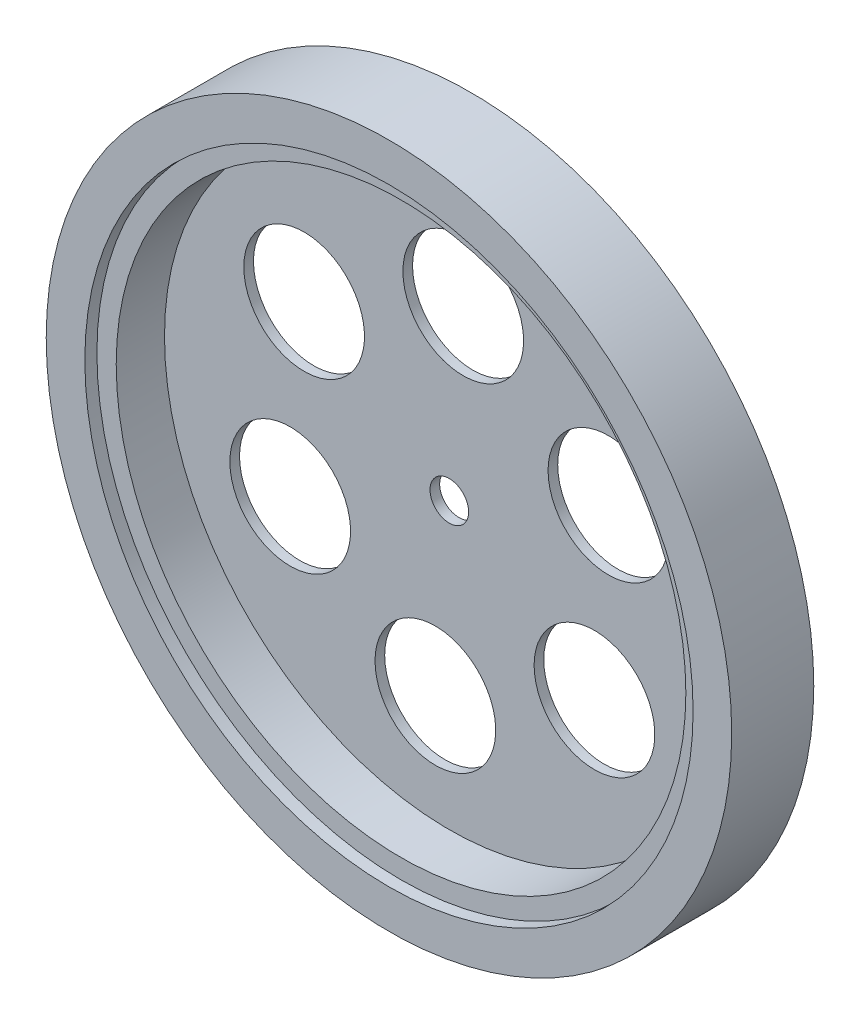
ISO-10303-21;
HEADER;
FILE_DESCRIPTION(('STEP AP214'),'2;1');
FILE_NAME('part.step','',(''),(''),'','','');
FILE_SCHEMA(('AUTOMOTIVE_DESIGN { 1 0 10303 214 1 1 1 1 }'));
ENDSEC;
DATA;
#1=APPLICATION_CONTEXT('core data for automotive mechanical design processes');
#2=APPLICATION_PROTOCOL_DEFINITION('international standard','automotive_design',2000,#1);
#3=PRODUCT_CONTEXT('',#1,'mechanical');
#4=PRODUCT('Part','Part','',(#3));
#5=PRODUCT_RELATED_PRODUCT_CATEGORY('part','',(#4));
#6=PRODUCT_DEFINITION_FORMATION('','',#4);
#7=PRODUCT_DEFINITION_CONTEXT('part definition',#1,'design');
#8=PRODUCT_DEFINITION('design','',#6,#7);
#9=PRODUCT_DEFINITION_SHAPE('','',#8);
#10=(LENGTH_UNIT() NAMED_UNIT(*) SI_UNIT(.MILLI.,.METRE.));
#11=(NAMED_UNIT(*) PLANE_ANGLE_UNIT() SI_UNIT($,.RADIAN.));
#12=(NAMED_UNIT(*) SI_UNIT($,.STERADIAN.) SOLID_ANGLE_UNIT());
#13=UNCERTAINTY_MEASURE_WITH_UNIT(LENGTH_MEASURE(1.E-05),#10,'distance_accuracy_value','');
#14=(GEOMETRIC_REPRESENTATION_CONTEXT(3) GLOBAL_UNCERTAINTY_ASSIGNED_CONTEXT((#13)) GLOBAL_UNIT_ASSIGNED_CONTEXT((#10,
#11,#12)) REPRESENTATION_CONTEXT('',''));
#15=CARTESIAN_POINT('',(0.,0.,0.));
#16=DIRECTION('',(0.,0.,1.));
#17=DIRECTION('',(1.,0.,0.));
#18=AXIS2_PLACEMENT_3D('',#15,#16,#17);
#19=CARTESIAN_POINT('',(0.,0.,6.));
#20=DIRECTION('',(0.,0.,-1.));
#21=DIRECTION('',(-1.,0.,0.));
#22=AXIS2_PLACEMENT_3D('',#19,#20,#21);
#23=CYLINDRICAL_SURFACE('',#22,29.5);
#24=CARTESIAN_POINT('',(0.,0.,6.));
#25=DIRECTION('',(0.,0.,1.));
#26=DIRECTION('',(1.,0.,0.));
#27=AXIS2_PLACEMENT_3D('',#24,#25,#26);
#28=CIRCLE('',#27,29.5);
#29=CARTESIAN_POINT('',(29.5,0.,6.));
#30=VERTEX_POINT('',#29);
#31=EDGE_CURVE('E41',#30,#30,#28,.T.);
#32=ORIENTED_EDGE('',*,*,#31,.T.);
#33=EDGE_LOOP('',(#32));
#34=FACE_BOUND('',#33,.T.);
#35=CARTESIAN_POINT('',(0.,0.,1.));
#36=DIRECTION('',(0.,0.,-1.));
#37=DIRECTION('',(-1.,0.,0.));
#38=AXIS2_PLACEMENT_3D('',#35,#36,#37);
#39=CIRCLE('',#38,29.5);
#40=CARTESIAN_POINT('',(-29.5,0.,1.));
#41=VERTEX_POINT('',#40);
#42=EDGE_CURVE('E46',#41,#41,#39,.T.);
#43=ORIENTED_EDGE('',*,*,#42,.T.);
#44=EDGE_LOOP('',(#43));
#45=FACE_BOUND('',#44,.T.);
#46=ADVANCED_FACE('F34',(#34,#45),#23,.F.);
#47=CARTESIAN_POINT('',(0.,0.,6.));
#48=DIRECTION('',(0.,0.,1.));
#49=DIRECTION('',(1.,0.,0.));
#50=AXIS2_PLACEMENT_3D('',#47,#48,#49);
#51=PLANE('',#50);
#52=CARTESIAN_POINT('',(0.,0.,6.));
#53=DIRECTION('',(0.,0.,1.));
#54=DIRECTION('',(1.,0.,0.));
#55=AXIS2_PLACEMENT_3D('',#52,#53,#54);
#56=CIRCLE('',#55,31.5);
#57=CARTESIAN_POINT('',(31.5,0.,6.));
#58=VERTEX_POINT('',#57);
#59=EDGE_CURVE('E10',#58,#58,#56,.F.);
#60=ORIENTED_EDGE('',*,*,#59,.F.);
#61=EDGE_LOOP('',(#60));
#62=FACE_BOUND('',#61,.T.);
#63=ORIENTED_EDGE('',*,*,#31,.F.);
#64=EDGE_LOOP('',(#63));
#65=FACE_BOUND('',#64,.T.);
#66=ADVANCED_FACE('F118',(#62,#65),#51,.T.);
#67=CARTESIAN_POINT('',(0.,0.,0.));
#68=DIRECTION('',(0.,0.,1.));
#69=DIRECTION('',(1.,0.,0.));
#70=AXIS2_PLACEMENT_3D('',#67,#68,#69);
#71=PLANE('',#70);
#72=CARTESIAN_POINT('',(0.,0.,0.));
#73=DIRECTION('',(0.,0.,1.));
#74=DIRECTION('',(1.,0.,0.));
#75=AXIS2_PLACEMENT_3D('',#72,#73,#74);
#76=CIRCLE('',#75,31.5);
#77=CARTESIAN_POINT('',(31.5,0.,0.));
#78=VERTEX_POINT('',#77);
#79=EDGE_CURVE('E37',#78,#78,#76,.F.);
#80=ORIENTED_EDGE('',*,*,#79,.T.);
#81=EDGE_LOOP('',(#80));
#82=FACE_BOUND('',#81,.T.);
#83=CARTESIAN_POINT('',(15.033277380089,-10.3471286458275,0.));
#84=DIRECTION('',(0.,0.,-1.));
#85=DIRECTION('',(-0.50000000000001,-0.866025403784433,0.));
#86=AXIS2_PLACEMENT_3D('',#83,#84,#85);
#87=CIRCLE('',#86,6.25);
#88=CARTESIAN_POINT('',(11.9082773800889,-15.7597874194802,0.));
#89=VERTEX_POINT('',#88);
#90=EDGE_CURVE('E52',#89,#89,#87,.T.);
#91=ORIENTED_EDGE('',*,*,#90,.F.);
#92=EDGE_LOOP('',(#91));
#93=FACE_BOUND('',#92,.T.);
#94=CARTESIAN_POINT('',(16.4775149535568,7.84563579038132,0.));
#95=DIRECTION('',(0.,0.,-1.));
#96=DIRECTION('',(0.499999999999992,-0.866025403784443,0.));
#97=AXIS2_PLACEMENT_3D('',#94,#95,#96);
#98=CIRCLE('',#97,6.25);
#99=CARTESIAN_POINT('',(19.6025149535567,2.43297701672854,0.));
#100=VERTEX_POINT('',#99);
#101=EDGE_CURVE('E56',#100,#100,#98,.T.);
#102=ORIENTED_EDGE('',*,*,#101,.F.);
#103=EDGE_LOOP('',(#102));
#104=FACE_BOUND('',#103,.T.);
#105=CARTESIAN_POINT('',(1.44423757346761,18.1927644362088,0.));
#106=DIRECTION('',(0.,0.,-1.));
#107=DIRECTION('',(1.,0.,0.));
#108=AXIS2_PLACEMENT_3D('',#105,#106,#107);
#109=CIRCLE('',#108,6.25);
#110=CARTESIAN_POINT('',(7.69423757346761,18.1927644362088,0.));
#111=VERTEX_POINT('',#110);
#112=EDGE_CURVE('E60',#111,#111,#109,.T.);
#113=ORIENTED_EDGE('',*,*,#112,.F.);
#114=EDGE_LOOP('',(#113));
#115=FACE_BOUND('',#114,.T.);
#116=CARTESIAN_POINT('',(-15.0332773800891,10.3471286458274,0.));
#117=DIRECTION('',(0.,0.,-1.));
#118=DIRECTION('',(0.500000000000004,0.866025403784436,0.));
#119=AXIS2_PLACEMENT_3D('',#116,#117,#118);
#120=CIRCLE('',#119,6.25);
#121=CARTESIAN_POINT('',(-11.908277380089,15.7597874194802,0.));
#122=VERTEX_POINT('',#121);
#123=EDGE_CURVE('E64',#122,#122,#120,.T.);
#124=ORIENTED_EDGE('',*,*,#123,.F.);
#125=EDGE_LOOP('',(#124));
#126=FACE_BOUND('',#125,.T.);
#127=CARTESIAN_POINT('',(-16.4775149535567,-7.84563579038143,0.));
#128=DIRECTION('',(0.,0.,-1.));
#129=DIRECTION('',(-0.499999999999998,0.86602540378444,0.));
#130=AXIS2_PLACEMENT_3D('',#127,#128,#129);
#131=CIRCLE('',#130,6.25);
#132=CARTESIAN_POINT('',(-19.6025149535567,-2.43297701672868,0.));
#133=VERTEX_POINT('',#132);
#134=EDGE_CURVE('E68',#133,#133,#131,.T.);
#135=ORIENTED_EDGE('',*,*,#134,.F.);
#136=EDGE_LOOP('',(#135));
#137=FACE_BOUND('',#136,.T.);
#138=CARTESIAN_POINT('',(-1.44423757346761,-18.1927644362088,0.));
#139=DIRECTION('',(0.,0.,-1.));
#140=DIRECTION('',(-1.,0.,0.));
#141=AXIS2_PLACEMENT_3D('',#138,#139,#140);
#142=CIRCLE('',#141,6.25);
#143=CARTESIAN_POINT('',(-7.69423757346761,-18.1927644362088,0.));
#144=VERTEX_POINT('',#143);
#145=EDGE_CURVE('E72',#144,#144,#142,.T.);
#146=ORIENTED_EDGE('',*,*,#145,.F.);
#147=EDGE_LOOP('',(#146));
#148=FACE_BOUND('',#147,.T.);
#149=CARTESIAN_POINT('',(0.,0.,0.));
#150=DIRECTION('',(0.,0.,-1.));
#151=DIRECTION('',(-1.,0.,0.));
#152=AXIS2_PLACEMENT_3D('',#149,#150,#151);
#153=CIRCLE('',#152,2.);
#154=CARTESIAN_POINT('',(-2.,0.,0.));
#155=VERTEX_POINT('',#154);
#156=EDGE_CURVE('E79',#155,#155,#153,.T.);
#157=ORIENTED_EDGE('',*,*,#156,.F.);
#158=EDGE_LOOP('',(#157));
#159=FACE_BOUND('',#158,.T.);
#160=ADVANCED_FACE('F123',(#82,#93,#104,#115,#126,#137,#148,#159),#71,.F.);
#161=CARTESIAN_POINT('',(0.,0.,1.));
#162=DIRECTION('',(0.,0.,-1.));
#163=DIRECTION('',(-1.,0.,0.));
#164=AXIS2_PLACEMENT_3D('',#161,#162,#163);
#165=PLANE('',#164);
#166=CARTESIAN_POINT('',(15.033277380089,-10.3471286458275,1.));
#167=DIRECTION('',(0.,0.,-1.));
#168=DIRECTION('',(-1.,0.,0.));
#169=AXIS2_PLACEMENT_3D('',#166,#167,#168);
#170=CIRCLE('',#169,6.25);
#171=CARTESIAN_POINT('',(8.78327738008899,-10.3471286458275,1.));
#172=VERTEX_POINT('',#171);
#173=EDGE_CURVE('E55',#172,#172,#170,.T.);
#174=ORIENTED_EDGE('',*,*,#173,.T.);
#175=EDGE_LOOP('',(#174));
#176=FACE_BOUND('',#175,.T.);
#177=CARTESIAN_POINT('',(16.4775149535568,7.84563579038132,1.));
#178=DIRECTION('',(0.,0.,-1.));
#179=DIRECTION('',(-1.,0.,0.));
#180=AXIS2_PLACEMENT_3D('',#177,#178,#179);
#181=CIRCLE('',#180,6.25);
#182=CARTESIAN_POINT('',(10.2275149535568,7.84563579038132,1.));
#183=VERTEX_POINT('',#182);
#184=EDGE_CURVE('E59',#183,#183,#181,.T.);
#185=ORIENTED_EDGE('',*,*,#184,.T.);
#186=EDGE_LOOP('',(#185));
#187=FACE_BOUND('',#186,.T.);
#188=CARTESIAN_POINT('',(1.44423757346761,18.1927644362088,1.));
#189=DIRECTION('',(0.,0.,-1.));
#190=DIRECTION('',(-1.,0.,0.));
#191=AXIS2_PLACEMENT_3D('',#188,#189,#190);
#192=CIRCLE('',#191,6.25);
#193=CARTESIAN_POINT('',(-4.80576242653239,18.1927644362088,1.));
#194=VERTEX_POINT('',#193);
#195=EDGE_CURVE('E63',#194,#194,#192,.T.);
#196=ORIENTED_EDGE('',*,*,#195,.T.);
#197=EDGE_LOOP('',(#196));
#198=FACE_BOUND('',#197,.T.);
#199=CARTESIAN_POINT('',(-15.0332773800891,10.3471286458274,1.));
#200=DIRECTION('',(0.,0.,-1.));
#201=DIRECTION('',(-1.,0.,0.));
#202=AXIS2_PLACEMENT_3D('',#199,#200,#201);
#203=CIRCLE('',#202,6.25);
#204=CARTESIAN_POINT('',(-21.2832773800891,10.3471286458274,1.));
#205=VERTEX_POINT('',#204);
#206=EDGE_CURVE('E67',#205,#205,#203,.T.);
#207=ORIENTED_EDGE('',*,*,#206,.T.);
#208=EDGE_LOOP('',(#207));
#209=FACE_BOUND('',#208,.T.);
#210=CARTESIAN_POINT('',(-16.4775149535567,-7.84563579038143,1.));
#211=DIRECTION('',(0.,0.,-1.));
#212=DIRECTION('',(-1.,0.,0.));
#213=AXIS2_PLACEMENT_3D('',#210,#211,#212);
#214=CIRCLE('',#213,6.25);
#215=CARTESIAN_POINT('',(-22.7275149535567,-7.84563579038143,1.));
#216=VERTEX_POINT('',#215);
#217=EDGE_CURVE('E71',#216,#216,#214,.T.);
#218=ORIENTED_EDGE('',*,*,#217,.T.);
#219=EDGE_LOOP('',(#218));
#220=FACE_BOUND('',#219,.T.);
#221=CARTESIAN_POINT('',(-1.44423757346761,-18.1927644362088,1.));
#222=DIRECTION('',(0.,0.,-1.));
#223=DIRECTION('',(-1.,0.,0.));
#224=AXIS2_PLACEMENT_3D('',#221,#222,#223);
#225=CIRCLE('',#224,6.25);
#226=CARTESIAN_POINT('',(-7.69423757346761,-18.1927644362088,1.));
#227=VERTEX_POINT('',#226);
#228=EDGE_CURVE('E75',#227,#227,#225,.T.);
#229=ORIENTED_EDGE('',*,*,#228,.T.);
#230=EDGE_LOOP('',(#229));
#231=FACE_BOUND('',#230,.T.);
#232=ORIENTED_EDGE('',*,*,#42,.F.);
#233=EDGE_LOOP('',(#232));
#234=FACE_BOUND('',#233,.T.);
#235=CARTESIAN_POINT('',(0.,0.,1.));
#236=DIRECTION('',(0.,0.,-1.));
#237=DIRECTION('',(-1.,0.,0.));
#238=AXIS2_PLACEMENT_3D('',#235,#236,#237);
#239=CIRCLE('',#238,2.);
#240=CARTESIAN_POINT('',(-2.,0.,1.));
#241=VERTEX_POINT('',#240);
#242=EDGE_CURVE('E76',#241,#241,#239,.T.);
#243=ORIENTED_EDGE('',*,*,#242,.T.);
#244=EDGE_LOOP('',(#243));
#245=FACE_BOUND('',#244,.T.);
#246=ADVANCED_FACE('F96',(#176,#187,#198,#209,#220,#231,#234,#245),#165,.F.);
#247=CARTESIAN_POINT('',(0.,0.,1.));
#248=DIRECTION('',(0.,0.,-1.));
#249=DIRECTION('',(-1.,0.,0.));
#250=AXIS2_PLACEMENT_3D('',#247,#248,#249);
#251=CYLINDRICAL_SURFACE('',#250,2.);
#252=ORIENTED_EDGE('',*,*,#242,.F.);
#253=EDGE_LOOP('',(#252));
#254=FACE_BOUND('',#253,.T.);
#255=ORIENTED_EDGE('',*,*,#156,.T.);
#256=EDGE_LOOP('',(#255));
#257=FACE_BOUND('',#256,.T.);
#258=ADVANCED_FACE('F132',(#254,#257),#251,.F.);
#259=CARTESIAN_POINT('',(-1.44423757346761,-18.1927644362088,7.));
#260=DIRECTION('',(0.,0.,-1.));
#261=DIRECTION('',(-1.,0.,0.));
#262=AXIS2_PLACEMENT_3D('',#259,#260,#261);
#263=CYLINDRICAL_SURFACE('',#262,6.25);
#264=ORIENTED_EDGE('',*,*,#145,.T.);
#265=EDGE_LOOP('',(#264));
#266=FACE_BOUND('',#265,.T.);
#267=ORIENTED_EDGE('',*,*,#228,.F.);
#268=EDGE_LOOP('',(#267));
#269=FACE_BOUND('',#268,.T.);
#270=ADVANCED_FACE('F138',(#266,#269),#263,.F.);
#271=CARTESIAN_POINT('',(-16.4775149535567,-7.84563579038143,7.));
#272=DIRECTION('',(0.,0.,-1.));
#273=DIRECTION('',(-1.,0.,0.));
#274=AXIS2_PLACEMENT_3D('',#271,#272,#273);
#275=CYLINDRICAL_SURFACE('',#274,6.25);
#276=ORIENTED_EDGE('',*,*,#134,.T.);
#277=EDGE_LOOP('',(#276));
#278=FACE_BOUND('',#277,.T.);
#279=ORIENTED_EDGE('',*,*,#217,.F.);
#280=EDGE_LOOP('',(#279));
#281=FACE_BOUND('',#280,.T.);
#282=ADVANCED_FACE('F151',(#278,#281),#275,.F.);
#283=CARTESIAN_POINT('',(-15.0332773800891,10.3471286458274,7.));
#284=DIRECTION('',(0.,0.,-1.));
#285=DIRECTION('',(-1.,0.,0.));
#286=AXIS2_PLACEMENT_3D('',#283,#284,#285);
#287=CYLINDRICAL_SURFACE('',#286,6.25);
#288=ORIENTED_EDGE('',*,*,#123,.T.);
#289=EDGE_LOOP('',(#288));
#290=FACE_BOUND('',#289,.T.);
#291=ORIENTED_EDGE('',*,*,#206,.F.);
#292=EDGE_LOOP('',(#291));
#293=FACE_BOUND('',#292,.T.);
#294=ADVANCED_FACE('F155',(#290,#293),#287,.F.);
#295=CARTESIAN_POINT('',(1.44423757346761,18.1927644362088,7.));
#296=DIRECTION('',(0.,0.,-1.));
#297=DIRECTION('',(-1.,0.,0.));
#298=AXIS2_PLACEMENT_3D('',#295,#296,#297);
#299=CYLINDRICAL_SURFACE('',#298,6.25);
#300=ORIENTED_EDGE('',*,*,#112,.T.);
#301=EDGE_LOOP('',(#300));
#302=FACE_BOUND('',#301,.T.);
#303=ORIENTED_EDGE('',*,*,#195,.F.);
#304=EDGE_LOOP('',(#303));
#305=FACE_BOUND('',#304,.T.);
#306=ADVANCED_FACE('F113',(#302,#305),#299,.F.);
#307=CARTESIAN_POINT('',(16.4775149535568,7.84563579038132,7.));
#308=DIRECTION('',(0.,0.,-1.));
#309=DIRECTION('',(-1.,0.,0.));
#310=AXIS2_PLACEMENT_3D('',#307,#308,#309);
#311=CYLINDRICAL_SURFACE('',#310,6.25);
#312=ORIENTED_EDGE('',*,*,#101,.T.);
#313=EDGE_LOOP('',(#312));
#314=FACE_BOUND('',#313,.T.);
#315=ORIENTED_EDGE('',*,*,#184,.F.);
#316=EDGE_LOOP('',(#315));
#317=FACE_BOUND('',#316,.T.);
#318=ADVANCED_FACE('F102',(#314,#317),#311,.F.);
#319=CARTESIAN_POINT('',(15.033277380089,-10.3471286458275,7.));
#320=DIRECTION('',(0.,0.,-1.));
#321=DIRECTION('',(-1.,0.,0.));
#322=AXIS2_PLACEMENT_3D('',#319,#320,#321);
#323=CYLINDRICAL_SURFACE('',#322,6.25);
#324=ORIENTED_EDGE('',*,*,#90,.T.);
#325=EDGE_LOOP('',(#324));
#326=FACE_BOUND('',#325,.T.);
#327=ORIENTED_EDGE('',*,*,#173,.F.);
#328=EDGE_LOOP('',(#327));
#329=FACE_BOUND('',#328,.T.);
#330=ADVANCED_FACE('F99',(#326,#329),#323,.F.);
#331=CARTESIAN_POINT('',(0.,0.,-1.25));
#332=DIRECTION('',(0.,0.,1.));
#333=DIRECTION('',(1.,0.,0.));
#334=AXIS2_PLACEMENT_3D('',#331,#332,#333);
#335=CYLINDRICAL_SURFACE('',#334,31.5);
#336=CARTESIAN_POINT('',(0.,0.,-1.25));
#337=DIRECTION('',(0.,0.,-1.));
#338=DIRECTION('',(-1.,0.,0.));
#339=AXIS2_PLACEMENT_3D('',#336,#337,#338);
#340=CIRCLE('',#339,31.5);
#341=CARTESIAN_POINT('',(-31.5,0.,-1.25));
#342=VERTEX_POINT('',#341);
#343=EDGE_CURVE('E270',#342,#342,#340,.T.);
#344=ORIENTED_EDGE('',*,*,#343,.T.);
#345=EDGE_LOOP('',(#344));
#346=FACE_BOUND('',#345,.T.);
#347=ORIENTED_EDGE('',*,*,#79,.F.);
#348=EDGE_LOOP('',(#347));
#349=FACE_BOUND('',#348,.T.);
#350=ADVANCED_FACE('F101',(#346,#349),#335,.F.);
#351=CARTESIAN_POINT('',(0.,0.,-1.25));
#352=DIRECTION('',(0.,0.,-1.));
#353=DIRECTION('',(-1.,0.,0.));
#354=AXIS2_PLACEMENT_3D('',#351,#352,#353);
#355=PLANE('',#354);
#356=CARTESIAN_POINT('',(0.,0.,-1.25));
#357=DIRECTION('',(0.,0.,-1.));
#358=DIRECTION('',(-1.,0.,0.));
#359=AXIS2_PLACEMENT_3D('',#356,#357,#358);
#360=CIRCLE('',#359,35.5);
#361=CARTESIAN_POINT('',(-35.5,0.,-1.25));
#362=VERTEX_POINT('',#361);
#363=EDGE_CURVE('E50',#362,#362,#360,.T.);
#364=ORIENTED_EDGE('',*,*,#363,.T.);
#365=EDGE_LOOP('',(#364));
#366=FACE_BOUND('',#365,.T.);
#367=ORIENTED_EDGE('',*,*,#343,.F.);
#368=EDGE_LOOP('',(#367));
#369=FACE_BOUND('',#368,.T.);
#370=ADVANCED_FACE('F109',(#366,#369),#355,.T.);
#371=CARTESIAN_POINT('',(0.,0.,-1.25));
#372=DIRECTION('',(0.,0.,1.));
#373=DIRECTION('',(1.,0.,0.));
#374=AXIS2_PLACEMENT_3D('',#371,#372,#373);
#375=CYLINDRICAL_SURFACE('',#374,35.5);
#376=ORIENTED_EDGE('',*,*,#363,.F.);
#377=EDGE_LOOP('',(#376));
#378=FACE_BOUND('',#377,.T.);
#379=CARTESIAN_POINT('',(0.,0.,7.25));
#380=DIRECTION('',(0.,0.,-1.));
#381=DIRECTION('',(-1.,0.,0.));
#382=AXIS2_PLACEMENT_3D('',#379,#380,#381);
#383=CIRCLE('',#382,35.5);
#384=CARTESIAN_POINT('',(-35.5,0.,7.25));
#385=VERTEX_POINT('',#384);
#386=EDGE_CURVE('E268',#385,#385,#383,.T.);
#387=ORIENTED_EDGE('',*,*,#386,.T.);
#388=EDGE_LOOP('',(#387));
#389=FACE_BOUND('',#388,.T.);
#390=ADVANCED_FACE('F225',(#378,#389),#375,.T.);
#391=ORIENTED_EDGE('',*,*,#59,.T.);
#392=EDGE_LOOP('',(#391));
#393=FACE_BOUND('',#392,.T.);
#394=CARTESIAN_POINT('',(0.,0.,7.25));
#395=DIRECTION('',(0.,0.,-1.));
#396=DIRECTION('',(-1.,0.,0.));
#397=AXIS2_PLACEMENT_3D('',#394,#395,#396);
#398=CIRCLE('',#397,31.5);
#399=CARTESIAN_POINT('',(-31.5,0.,7.25));
#400=VERTEX_POINT('',#399);
#401=EDGE_CURVE('E265',#400,#400,#398,.T.);
#402=ORIENTED_EDGE('',*,*,#401,.F.);
#403=EDGE_LOOP('',(#402));
#404=FACE_BOUND('',#403,.T.);
#405=ADVANCED_FACE('F112',(#393,#404),#335,.F.);
#406=CARTESIAN_POINT('',(0.,0.,7.25));
#407=DIRECTION('',(0.,0.,-1.));
#408=DIRECTION('',(-1.,0.,0.));
#409=AXIS2_PLACEMENT_3D('',#406,#407,#408);
#410=PLANE('',#409);
#411=ORIENTED_EDGE('',*,*,#401,.T.);
#412=EDGE_LOOP('',(#411));
#413=FACE_BOUND('',#412,.T.);
#414=ORIENTED_EDGE('',*,*,#386,.F.);
#415=EDGE_LOOP('',(#414));
#416=FACE_BOUND('',#415,.T.);
#417=ADVANCED_FACE('F245',(#413,#416),#410,.F.);
#418=CLOSED_SHELL('',(#46,#66,#160,#246,#258,#270,#282,#294,#306,#318,#330,#350,#370,#390,#405,#417));
#419=MANIFOLD_SOLID_BREP('B2',#418);
#420=ADVANCED_BREP_SHAPE_REPRESENTATION('',(#18,#419),#14);
#421=SHAPE_DEFINITION_REPRESENTATION(#9,#420);
ENDSEC;
END-ISO-10303-21;
